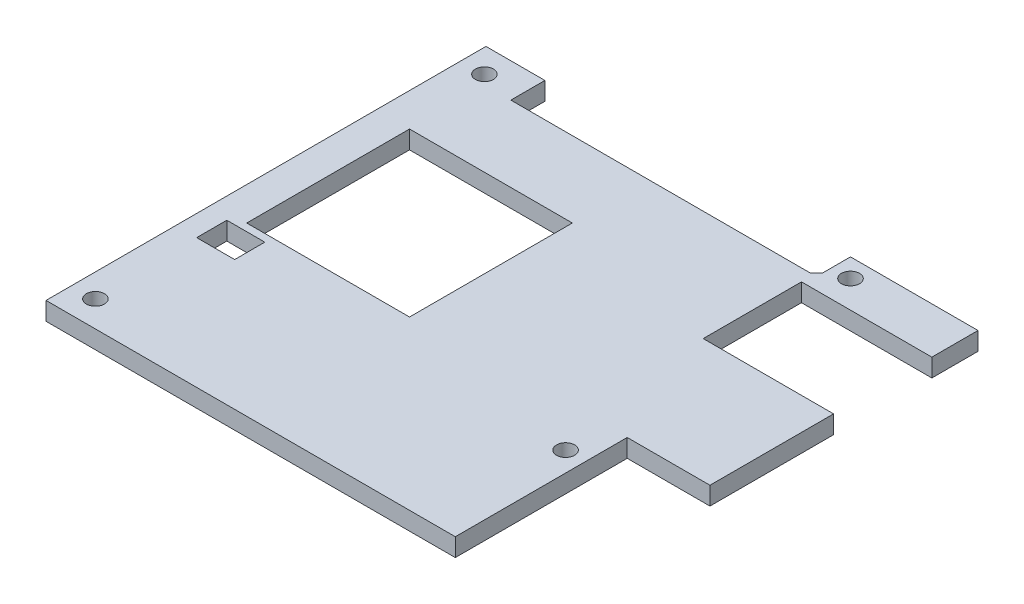
ISO-10303-21;
HEADER;
FILE_DESCRIPTION(('STEP AP214'),'2;1');
FILE_NAME('part.step','',(''),(''),'','','');
FILE_SCHEMA(('AUTOMOTIVE_DESIGN { 1 0 10303 214 1 1 1 1 }'));
ENDSEC;
DATA;
#1=APPLICATION_CONTEXT('core data for automotive mechanical design processes');
#2=APPLICATION_PROTOCOL_DEFINITION('international standard','automotive_design',2000,#1);
#3=PRODUCT_CONTEXT('',#1,'mechanical');
#4=PRODUCT('Part','Part','',(#3));
#5=PRODUCT_RELATED_PRODUCT_CATEGORY('part','',(#4));
#6=PRODUCT_DEFINITION_FORMATION('','',#4);
#7=PRODUCT_DEFINITION_CONTEXT('part definition',#1,'design');
#8=PRODUCT_DEFINITION('design','',#6,#7);
#9=PRODUCT_DEFINITION_SHAPE('','',#8);
#10=(LENGTH_UNIT() NAMED_UNIT(*) SI_UNIT(.MILLI.,.METRE.));
#11=(NAMED_UNIT(*) PLANE_ANGLE_UNIT() SI_UNIT($,.RADIAN.));
#12=(NAMED_UNIT(*) SI_UNIT($,.STERADIAN.) SOLID_ANGLE_UNIT());
#13=UNCERTAINTY_MEASURE_WITH_UNIT(LENGTH_MEASURE(1.E-05),#10,'distance_accuracy_value','');
#14=(GEOMETRIC_REPRESENTATION_CONTEXT(3) GLOBAL_UNCERTAINTY_ASSIGNED_CONTEXT((#13)) GLOBAL_UNIT_ASSIGNED_CONTEXT((#10,
#11,#12)) REPRESENTATION_CONTEXT('',''));
#15=CARTESIAN_POINT('',(0.,0.,0.));
#16=DIRECTION('',(0.,0.,1.));
#17=DIRECTION('',(1.,0.,0.));
#18=AXIS2_PLACEMENT_3D('',#15,#16,#17);
#19=CARTESIAN_POINT('',(0.,3.,-10.));
#20=DIRECTION('',(0.,0.,-1.));
#21=DIRECTION('',(-1.,0.,0.));
#22=AXIS2_PLACEMENT_3D('',#19,#20,#21);
#23=PLANE('',#22);
#24=DIRECTION('',(1.,0.,0.));
#25=VECTOR('',#24,1.);
#26=CARTESIAN_POINT('',(0.,0.,-10.));
#27=LINE('',#26,#25);
#28=CARTESIAN_POINT('',(-3.7,0.,-10.));
#29=VERTEX_POINT('',#28);
#30=CARTESIAN_POINT('',(2.6,0.,-10.));
#31=VERTEX_POINT('',#30);
#32=EDGE_CURVE('E328',#29,#31,#27,.T.);
#33=ORIENTED_EDGE('',*,*,#32,.T.);
#34=DIRECTION('',(0.,-1.,0.));
#35=VECTOR('',#34,1.);
#36=CARTESIAN_POINT('',(2.6,3.,-10.));
#37=LINE('',#36,#35);
#38=CARTESIAN_POINT('',(2.6,3.,-10.));
#39=VERTEX_POINT('',#38);
#40=EDGE_CURVE('E348',#39,#31,#37,.T.);
#41=ORIENTED_EDGE('',*,*,#40,.F.);
#42=DIRECTION('',(1.,0.,0.));
#43=VECTOR('',#42,1.);
#44=CARTESIAN_POINT('',(0.,3.,-10.));
#45=LINE('',#44,#43);
#46=CARTESIAN_POINT('',(-3.7,3.,-10.));
#47=VERTEX_POINT('',#46);
#48=EDGE_CURVE('E259',#47,#39,#45,.T.);
#49=ORIENTED_EDGE('',*,*,#48,.F.);
#50=DIRECTION('',(0.,-1.,0.));
#51=VECTOR('',#50,1.);
#52=CARTESIAN_POINT('',(-3.7,3.,-10.));
#53=LINE('',#52,#51);
#54=EDGE_CURVE('E341',#47,#29,#53,.T.);
#55=ORIENTED_EDGE('',*,*,#54,.T.);
#56=EDGE_LOOP('',(#33,#41,#49,#55));
#57=FACE_BOUND('',#56,.T.);
#58=ADVANCED_FACE('F38',(#57),#23,.F.);
#59=CARTESIAN_POINT('',(2.6,3.,0.));
#60=DIRECTION('',(1.,0.,0.));
#61=DIRECTION('',(0.,0.,-1.));
#62=AXIS2_PLACEMENT_3D('',#59,#60,#61);
#63=PLANE('',#62);
#64=DIRECTION('',(0.,0.,1.));
#65=VECTOR('',#64,1.);
#66=CARTESIAN_POINT('',(2.6,0.,0.));
#67=LINE('',#66,#65);
#68=CARTESIAN_POINT('',(2.6,0.,-5.));
#69=VERTEX_POINT('',#68);
#70=EDGE_CURVE('E331',#31,#69,#67,.T.);
#71=ORIENTED_EDGE('',*,*,#70,.T.);
#72=DIRECTION('',(0.,-1.,0.));
#73=VECTOR('',#72,1.);
#74=CARTESIAN_POINT('',(2.6,3.,-5.));
#75=LINE('',#74,#73);
#76=CARTESIAN_POINT('',(2.6,3.,-5.));
#77=VERTEX_POINT('',#76);
#78=EDGE_CURVE('E346',#77,#69,#75,.T.);
#79=ORIENTED_EDGE('',*,*,#78,.F.);
#80=DIRECTION('',(0.,0.,1.));
#81=VECTOR('',#80,1.);
#82=CARTESIAN_POINT('',(2.6,3.,0.));
#83=LINE('',#82,#81);
#84=EDGE_CURVE('E262',#39,#77,#83,.T.);
#85=ORIENTED_EDGE('',*,*,#84,.F.);
#86=ORIENTED_EDGE('',*,*,#40,.T.);
#87=EDGE_LOOP('',(#71,#79,#85,#86));
#88=FACE_BOUND('',#87,.T.);
#89=ADVANCED_FACE('F411',(#88),#63,.F.);
#90=CARTESIAN_POINT('',(0.,3.,-5.));
#91=DIRECTION('',(0.,0.,-1.));
#92=DIRECTION('',(-1.,0.,0.));
#93=AXIS2_PLACEMENT_3D('',#90,#91,#92);
#94=PLANE('',#93);
#95=DIRECTION('',(1.,0.,0.));
#96=VECTOR('',#95,1.);
#97=CARTESIAN_POINT('',(0.,0.,-5.));
#98=LINE('',#97,#96);
#99=CARTESIAN_POINT('',(-3.7,0.,-5.));
#100=VERTEX_POINT('',#99);
#101=EDGE_CURVE('E334',#100,#69,#98,.T.);
#102=ORIENTED_EDGE('',*,*,#101,.F.);
#103=DIRECTION('',(0.,-1.,0.));
#104=VECTOR('',#103,1.);
#105=CARTESIAN_POINT('',(-3.7,3.,-5.));
#106=LINE('',#105,#104);
#107=CARTESIAN_POINT('',(-3.7,3.,-5.));
#108=VERTEX_POINT('',#107);
#109=EDGE_CURVE('E343',#108,#100,#106,.T.);
#110=ORIENTED_EDGE('',*,*,#109,.F.);
#111=DIRECTION('',(1.,0.,0.));
#112=VECTOR('',#111,1.);
#113=CARTESIAN_POINT('',(0.,3.,-5.));
#114=LINE('',#113,#112);
#115=EDGE_CURVE('E264',#108,#77,#114,.T.);
#116=ORIENTED_EDGE('',*,*,#115,.T.);
#117=ORIENTED_EDGE('',*,*,#78,.T.);
#118=EDGE_LOOP('',(#102,#110,#116,#117));
#119=FACE_BOUND('',#118,.T.);
#120=ADVANCED_FACE('F417',(#119),#94,.T.);
#121=CARTESIAN_POINT('',(25.35,3.,0.));
#122=DIRECTION('',(-1.,0.,0.));
#123=DIRECTION('',(0.,0.,1.));
#124=AXIS2_PLACEMENT_3D('',#121,#122,#123);
#125=PLANE('',#124);
#126=DIRECTION('',(0.,0.,-1.));
#127=VECTOR('',#126,1.);
#128=CARTESIAN_POINT('',(25.35,0.,0.));
#129=LINE('',#128,#127);
#130=CARTESIAN_POINT('',(25.35,0.,-11.25));
#131=VERTEX_POINT('',#130);
#132=CARTESIAN_POINT('',(25.35,0.,-38.25));
#133=VERTEX_POINT('',#132);
#134=EDGE_CURVE('E316',#131,#133,#129,.T.);
#135=ORIENTED_EDGE('',*,*,#134,.F.);
#136=DIRECTION('',(0.,-1.,0.));
#137=VECTOR('',#136,1.);
#138=CARTESIAN_POINT('',(25.35,3.,-11.25));
#139=LINE('',#138,#137);
#140=CARTESIAN_POINT('',(25.35,3.,-11.25));
#141=VERTEX_POINT('',#140);
#142=EDGE_CURVE('E344',#141,#131,#139,.T.);
#143=ORIENTED_EDGE('',*,*,#142,.F.);
#144=DIRECTION('',(0.,0.,-1.));
#145=VECTOR('',#144,1.);
#146=CARTESIAN_POINT('',(25.35,3.,0.));
#147=LINE('',#146,#145);
#148=CARTESIAN_POINT('',(25.35,3.,-38.25));
#149=VERTEX_POINT('',#148);
#150=EDGE_CURVE('E248',#141,#149,#147,.T.);
#151=ORIENTED_EDGE('',*,*,#150,.T.);
#152=DIRECTION('',(0.,-1.,0.));
#153=VECTOR('',#152,1.);
#154=CARTESIAN_POINT('',(25.35,3.,-38.25));
#155=LINE('',#154,#153);
#156=EDGE_CURVE('E202',#149,#133,#155,.T.);
#157=ORIENTED_EDGE('',*,*,#156,.T.);
#158=EDGE_LOOP('',(#135,#143,#151,#157));
#159=FACE_BOUND('',#158,.T.);
#160=ADVANCED_FACE('F435',(#159),#125,.T.);
#161=CARTESIAN_POINT('',(0.,3.,-11.25));
#162=DIRECTION('',(0.,0.,-1.));
#163=DIRECTION('',(-1.,0.,0.));
#164=AXIS2_PLACEMENT_3D('',#161,#162,#163);
#165=PLANE('',#164);
#166=DIRECTION('',(1.,0.,0.));
#167=VECTOR('',#166,1.);
#168=CARTESIAN_POINT('',(0.,0.,-11.25));
#169=LINE('',#168,#167);
#170=CARTESIAN_POINT('',(-1.65,0.,-11.25));
#171=VERTEX_POINT('',#170);
#172=EDGE_CURVE('E319',#171,#131,#169,.T.);
#173=ORIENTED_EDGE('',*,*,#172,.F.);
#174=DIRECTION('',(0.,-1.,0.));
#175=VECTOR('',#174,1.);
#176=CARTESIAN_POINT('',(-1.65,3.,-11.25));
#177=LINE('',#176,#175);
#178=CARTESIAN_POINT('',(-1.65,3.,-11.25));
#179=VERTEX_POINT('',#178);
#180=EDGE_CURVE('E356',#179,#171,#177,.T.);
#181=ORIENTED_EDGE('',*,*,#180,.F.);
#182=DIRECTION('',(1.,0.,0.));
#183=VECTOR('',#182,1.);
#184=CARTESIAN_POINT('',(0.,3.,-11.25));
#185=LINE('',#184,#183);
#186=EDGE_CURVE('E251',#179,#141,#185,.T.);
#187=ORIENTED_EDGE('',*,*,#186,.T.);
#188=ORIENTED_EDGE('',*,*,#142,.T.);
#189=EDGE_LOOP('',(#173,#181,#187,#188));
#190=FACE_BOUND('',#189,.T.);
#191=ADVANCED_FACE('F431',(#190),#165,.T.);
#192=CARTESIAN_POINT('',(-1.65,3.,0.));
#193=DIRECTION('',(-1.,0.,0.));
#194=DIRECTION('',(0.,0.,1.));
#195=AXIS2_PLACEMENT_3D('',#192,#193,#194);
#196=PLANE('',#195);
#197=DIRECTION('',(0.,0.,-1.));
#198=VECTOR('',#197,1.);
#199=CARTESIAN_POINT('',(-1.65,0.,0.));
#200=LINE('',#199,#198);
#201=CARTESIAN_POINT('',(-1.65,0.,-38.25));
#202=VERTEX_POINT('',#201);
#203=EDGE_CURVE('E322',#171,#202,#200,.T.);
#204=ORIENTED_EDGE('',*,*,#203,.T.);
#205=DIRECTION('',(0.,-1.,0.));
#206=VECTOR('',#205,1.);
#207=CARTESIAN_POINT('',(-1.65,3.,-38.25));
#208=LINE('',#207,#206);
#209=CARTESIAN_POINT('',(-1.65,3.,-38.25));
#210=VERTEX_POINT('',#209);
#211=EDGE_CURVE('E353',#210,#202,#208,.T.);
#212=ORIENTED_EDGE('',*,*,#211,.F.);
#213=DIRECTION('',(0.,0.,-1.));
#214=VECTOR('',#213,1.);
#215=CARTESIAN_POINT('',(-1.65,3.,0.));
#216=LINE('',#215,#214);
#217=EDGE_CURVE('E254',#179,#210,#216,.T.);
#218=ORIENTED_EDGE('',*,*,#217,.F.);
#219=ORIENTED_EDGE('',*,*,#180,.T.);
#220=EDGE_LOOP('',(#204,#212,#218,#219));
#221=FACE_BOUND('',#220,.T.);
#222=ADVANCED_FACE('F428',(#221),#196,.F.);
#223=CARTESIAN_POINT('',(60.7,3.,0.));
#224=DIRECTION('',(1.,0.,0.));
#225=DIRECTION('',(0.,0.,-1.));
#226=AXIS2_PLACEMENT_3D('',#223,#224,#225);
#227=PLANE('',#226);
#228=DIRECTION('',(0.,0.,1.));
#229=VECTOR('',#228,1.);
#230=CARTESIAN_POINT('',(60.7,0.,0.));
#231=LINE('',#230,#229);
#232=CARTESIAN_POINT('',(60.7,0.,-12.));
#233=VERTEX_POINT('',#232);
#234=CARTESIAN_POINT('',(60.7,0.,16.51));
#235=VERTEX_POINT('',#234);
#236=EDGE_CURVE('E197',#233,#235,#231,.T.);
#237=ORIENTED_EDGE('',*,*,#236,.F.);
#238=DIRECTION('',(0.,-1.,0.));
#239=VECTOR('',#238,1.);
#240=CARTESIAN_POINT('',(60.7,3.,-12.));
#241=LINE('',#240,#239);
#242=CARTESIAN_POINT('',(60.7,3.,-12.));
#243=VERTEX_POINT('',#242);
#244=EDGE_CURVE('E192',#243,#233,#241,.T.);
#245=ORIENTED_EDGE('',*,*,#244,.F.);
#246=DIRECTION('',(0.,0.,1.));
#247=VECTOR('',#246,1.);
#248=CARTESIAN_POINT('',(60.7,3.,0.));
#249=LINE('',#248,#247);
#250=CARTESIAN_POINT('',(60.7,3.,16.51));
#251=VERTEX_POINT('',#250);
#252=EDGE_CURVE('E195',#243,#251,#249,.T.);
#253=ORIENTED_EDGE('',*,*,#252,.T.);
#254=DIRECTION('',(0.,-1.,0.));
#255=VECTOR('',#254,1.);
#256=CARTESIAN_POINT('',(60.7,3.,16.51));
#257=LINE('',#256,#255);
#258=EDGE_CURVE('E270',#251,#235,#257,.T.);
#259=ORIENTED_EDGE('',*,*,#258,.T.);
#260=EDGE_LOOP('',(#237,#245,#253,#259));
#261=FACE_BOUND('',#260,.T.);
#262=ADVANCED_FACE('F194',(#261),#227,.T.);
#263=CARTESIAN_POINT('',(0.,3.,-12.));
#264=DIRECTION('',(0.,0.,1.));
#265=DIRECTION('',(1.,0.,0.));
#266=AXIS2_PLACEMENT_3D('',#263,#264,#265);
#267=PLANE('',#266);
#268=DIRECTION('',(-1.,0.,0.));
#269=VECTOR('',#268,1.);
#270=CARTESIAN_POINT('',(0.,0.,-12.));
#271=LINE('',#270,#269);
#272=CARTESIAN_POINT('',(74.421,0.,-12.));
#273=VERTEX_POINT('',#272);
#274=EDGE_CURVE('E284',#273,#233,#271,.T.);
#275=ORIENTED_EDGE('',*,*,#274,.F.);
#276=DIRECTION('',(0.,-1.,0.));
#277=VECTOR('',#276,1.);
#278=CARTESIAN_POINT('',(74.421,3.,-12.));
#279=LINE('',#278,#277);
#280=CARTESIAN_POINT('',(74.421,3.,-12.));
#281=VERTEX_POINT('',#280);
#282=EDGE_CURVE('E203',#281,#273,#279,.T.);
#283=ORIENTED_EDGE('',*,*,#282,.F.);
#284=DIRECTION('',(-1.,0.,0.));
#285=VECTOR('',#284,1.);
#286=CARTESIAN_POINT('',(0.,3.,-12.));
#287=LINE('',#286,#285);
#288=EDGE_CURVE('E210',#281,#243,#287,.T.);
#289=ORIENTED_EDGE('',*,*,#288,.T.);
#290=ORIENTED_EDGE('',*,*,#244,.T.);
#291=EDGE_LOOP('',(#275,#283,#289,#290));
#292=FACE_BOUND('',#291,.T.);
#293=ADVANCED_FACE('F217',(#292),#267,.T.);
#294=CARTESIAN_POINT('',(74.421,3.,0.));
#295=DIRECTION('',(-1.,0.,0.));
#296=DIRECTION('',(0.,0.,1.));
#297=AXIS2_PLACEMENT_3D('',#294,#295,#296);
#298=PLANE('',#297);
#299=DIRECTION('',(0.,0.,-1.));
#300=VECTOR('',#299,1.);
#301=CARTESIAN_POINT('',(74.421,0.,0.));
#302=LINE('',#301,#300);
#303=CARTESIAN_POINT('',(74.421,0.,-32.5));
#304=VERTEX_POINT('',#303);
#305=EDGE_CURVE('E286',#273,#304,#302,.T.);
#306=ORIENTED_EDGE('',*,*,#305,.T.);
#307=DIRECTION('',(0.,-1.,0.));
#308=VECTOR('',#307,1.);
#309=CARTESIAN_POINT('',(74.421,3.,-32.5));
#310=LINE('',#309,#308);
#311=CARTESIAN_POINT('',(74.421,3.,-32.5));
#312=VERTEX_POINT('',#311);
#313=EDGE_CURVE('E379',#312,#304,#310,.T.);
#314=ORIENTED_EDGE('',*,*,#313,.F.);
#315=DIRECTION('',(0.,0.,-1.));
#316=VECTOR('',#315,1.);
#317=CARTESIAN_POINT('',(74.421,3.,0.));
#318=LINE('',#317,#316);
#319=EDGE_CURVE('E219',#281,#312,#318,.T.);
#320=ORIENTED_EDGE('',*,*,#319,.F.);
#321=ORIENTED_EDGE('',*,*,#282,.T.);
#322=EDGE_LOOP('',(#306,#314,#320,#321));
#323=FACE_BOUND('',#322,.T.);
#324=ADVANCED_FACE('F464',(#323),#298,.F.);
#325=CARTESIAN_POINT('',(0.,3.,-32.5));
#326=DIRECTION('',(0.,0.,1.));
#327=DIRECTION('',(1.,0.,0.));
#328=AXIS2_PLACEMENT_3D('',#325,#326,#327);
#329=PLANE('',#328);
#330=DIRECTION('',(-1.,0.,0.));
#331=VECTOR('',#330,1.);
#332=CARTESIAN_POINT('',(0.,0.,-32.5));
#333=LINE('',#332,#331);
#334=CARTESIAN_POINT('',(52.8,0.,-32.5));
#335=VERTEX_POINT('',#334);
#336=EDGE_CURVE('E289',#304,#335,#333,.T.);
#337=ORIENTED_EDGE('',*,*,#336,.T.);
#338=DIRECTION('',(0.,-1.,0.));
#339=VECTOR('',#338,1.);
#340=CARTESIAN_POINT('',(52.8,3.,-32.5));
#341=LINE('',#340,#339);
#342=CARTESIAN_POINT('',(52.8,3.,-32.5));
#343=VERTEX_POINT('',#342);
#344=EDGE_CURVE('E377',#343,#335,#341,.T.);
#345=ORIENTED_EDGE('',*,*,#344,.F.);
#346=DIRECTION('',(-1.,0.,0.));
#347=VECTOR('',#346,1.);
#348=CARTESIAN_POINT('',(0.,3.,-32.5));
#349=LINE('',#348,#347);
#350=EDGE_CURVE('E221',#312,#343,#349,.T.);
#351=ORIENTED_EDGE('',*,*,#350,.F.);
#352=ORIENTED_EDGE('',*,*,#313,.T.);
#353=EDGE_LOOP('',(#337,#345,#351,#352));
#354=FACE_BOUND('',#353,.T.);
#355=ADVANCED_FACE('F471',(#354),#329,.F.);
#356=CARTESIAN_POINT('',(52.8,3.,0.));
#357=DIRECTION('',(1.,0.,0.));
#358=DIRECTION('',(0.,0.,-1.));
#359=AXIS2_PLACEMENT_3D('',#356,#357,#358);
#360=PLANE('',#359);
#361=DIRECTION('',(0.,0.,1.));
#362=VECTOR('',#361,1.);
#363=CARTESIAN_POINT('',(52.8,0.,0.));
#364=LINE('',#363,#362);
#365=CARTESIAN_POINT('',(52.8,0.,-48.8));
#366=VERTEX_POINT('',#365);
#367=EDGE_CURVE('E293',#366,#335,#364,.T.);
#368=ORIENTED_EDGE('',*,*,#367,.F.);
#369=DIRECTION('',(0.,-1.,0.));
#370=VECTOR('',#369,1.);
#371=CARTESIAN_POINT('',(52.8,3.,-48.8));
#372=LINE('',#371,#370);
#373=CARTESIAN_POINT('',(52.8,3.,-48.8));
#374=VERTEX_POINT('',#373);
#375=EDGE_CURVE('E375',#374,#366,#372,.T.);
#376=ORIENTED_EDGE('',*,*,#375,.F.);
#377=DIRECTION('',(0.,0.,1.));
#378=VECTOR('',#377,1.);
#379=CARTESIAN_POINT('',(52.8,3.,0.));
#380=LINE('',#379,#378);
#381=EDGE_CURVE('E227',#374,#343,#380,.T.);
#382=ORIENTED_EDGE('',*,*,#381,.T.);
#383=ORIENTED_EDGE('',*,*,#344,.T.);
#384=EDGE_LOOP('',(#368,#376,#382,#383));
#385=FACE_BOUND('',#384,.T.);
#386=ADVANCED_FACE('F467',(#385),#360,.T.);
#387=CARTESIAN_POINT('',(0.,3.,-48.8));
#388=DIRECTION('',(0.,0.,1.));
#389=DIRECTION('',(1.,0.,0.));
#390=AXIS2_PLACEMENT_3D('',#387,#388,#389);
#391=PLANE('',#390);
#392=DIRECTION('',(-1.,0.,0.));
#393=VECTOR('',#392,1.);
#394=CARTESIAN_POINT('',(0.,0.,-48.8));
#395=LINE('',#394,#393);
#396=CARTESIAN_POINT('',(74.421,0.,-48.8));
#397=VERTEX_POINT('',#396);
#398=EDGE_CURVE('E296',#397,#366,#395,.T.);
#399=ORIENTED_EDGE('',*,*,#398,.F.);
#400=DIRECTION('',(0.,-1.,0.));
#401=VECTOR('',#400,1.);
#402=CARTESIAN_POINT('',(74.421,3.,-48.8));
#403=LINE('',#402,#401);
#404=CARTESIAN_POINT('',(74.421,3.,-48.8));
#405=VERTEX_POINT('',#404);
#406=EDGE_CURVE('E373',#405,#397,#403,.T.);
#407=ORIENTED_EDGE('',*,*,#406,.F.);
#408=DIRECTION('',(-1.,0.,0.));
#409=VECTOR('',#408,1.);
#410=CARTESIAN_POINT('',(0.,3.,-48.8));
#411=LINE('',#410,#409);
#412=EDGE_CURVE('E230',#405,#374,#411,.T.);
#413=ORIENTED_EDGE('',*,*,#412,.T.);
#414=ORIENTED_EDGE('',*,*,#375,.T.);
#415=EDGE_LOOP('',(#399,#407,#413,#414));
#416=FACE_BOUND('',#415,.T.);
#417=ADVANCED_FACE('F462',(#416),#391,.T.);
#418=CARTESIAN_POINT('',(74.421,0.,-56.452));
#419=VERTEX_POINT('',#418);
#420=EDGE_CURVE('E290',#397,#419,#302,.T.);
#421=ORIENTED_EDGE('',*,*,#420,.T.);
#422=DIRECTION('',(0.,-1.,0.));
#423=VECTOR('',#422,1.);
#424=CARTESIAN_POINT('',(74.421,3.,-56.452));
#425=LINE('',#424,#423);
#426=CARTESIAN_POINT('',(74.421,3.,-56.452));
#427=VERTEX_POINT('',#426);
#428=EDGE_CURVE('E371',#427,#419,#425,.T.);
#429=ORIENTED_EDGE('',*,*,#428,.F.);
#430=EDGE_CURVE('E223',#405,#427,#318,.T.);
#431=ORIENTED_EDGE('',*,*,#430,.F.);
#432=ORIENTED_EDGE('',*,*,#406,.T.);
#433=EDGE_LOOP('',(#421,#429,#431,#432));
#434=FACE_BOUND('',#433,.T.);
#435=ADVANCED_FACE('F459',(#434),#298,.F.);
#436=CARTESIAN_POINT('',(0.,3.,-56.452));
#437=DIRECTION('',(0.,0.,-1.));
#438=DIRECTION('',(-1.,0.,0.));
#439=AXIS2_PLACEMENT_3D('',#436,#437,#438);
#440=PLANE('',#439);
#441=DIRECTION('',(1.,0.,0.));
#442=VECTOR('',#441,1.);
#443=CARTESIAN_POINT('',(0.,0.,-56.452));
#444=LINE('',#443,#442);
#445=CARTESIAN_POINT('',(53.276,0.,-56.452));
#446=VERTEX_POINT('',#445);
#447=EDGE_CURVE('E299',#446,#419,#444,.T.);
#448=ORIENTED_EDGE('',*,*,#447,.F.);
#449=DIRECTION('',(0.,-1.,0.));
#450=VECTOR('',#449,1.);
#451=CARTESIAN_POINT('',(53.276,3.,-56.452));
#452=LINE('',#451,#450);
#453=CARTESIAN_POINT('',(53.276,3.,-56.452));
#454=VERTEX_POINT('',#453);
#455=EDGE_CURVE('E368',#454,#446,#452,.T.);
#456=ORIENTED_EDGE('',*,*,#455,.F.);
#457=DIRECTION('',(1.,0.,0.));
#458=VECTOR('',#457,1.);
#459=CARTESIAN_POINT('',(0.,3.,-56.452));
#460=LINE('',#459,#458);
#461=EDGE_CURVE('E233',#454,#427,#460,.T.);
#462=ORIENTED_EDGE('',*,*,#461,.T.);
#463=ORIENTED_EDGE('',*,*,#428,.T.);
#464=EDGE_LOOP('',(#448,#456,#462,#463));
#465=FACE_BOUND('',#464,.T.);
#466=ADVANCED_FACE('F451',(#465),#440,.T.);
#467=CARTESIAN_POINT('',(53.276,3.,0.));
#468=DIRECTION('',(-1.,0.,0.));
#469=DIRECTION('',(0.,0.,1.));
#470=AXIS2_PLACEMENT_3D('',#467,#468,#469);
#471=PLANE('',#470);
#472=DIRECTION('',(0.,0.,-1.));
#473=VECTOR('',#472,1.);
#474=CARTESIAN_POINT('',(53.276,0.,0.));
#475=LINE('',#474,#473);
#476=CARTESIAN_POINT('',(53.276,0.,-51.8));
#477=VERTEX_POINT('',#476);
#478=EDGE_CURVE('E302',#477,#446,#475,.T.);
#479=ORIENTED_EDGE('',*,*,#478,.F.);
#480=DIRECTION('',(0.,1.,0.));
#481=VECTOR('',#480,1.);
#482=CARTESIAN_POINT('',(53.276,3.,-51.8));
#483=LINE('',#482,#481);
#484=CARTESIAN_POINT('',(53.276,3.,-51.8));
#485=VERTEX_POINT('',#484);
#486=EDGE_CURVE('E54',#477,#485,#483,.T.);
#487=ORIENTED_EDGE('',*,*,#486,.T.);
#488=DIRECTION('',(0.,0.,-1.));
#489=VECTOR('',#488,1.);
#490=CARTESIAN_POINT('',(53.276,3.,0.));
#491=LINE('',#490,#489);
#492=EDGE_CURVE('E236',#485,#454,#491,.T.);
#493=ORIENTED_EDGE('',*,*,#492,.T.);
#494=ORIENTED_EDGE('',*,*,#455,.T.);
#495=EDGE_LOOP('',(#479,#487,#493,#494));
#496=FACE_BOUND('',#495,.T.);
#497=ADVANCED_FACE('F456',(#496),#471,.T.);
#498=CARTESIAN_POINT('',(0.,3.,-50.8));
#499=DIRECTION('',(0.,0.,-1.));
#500=DIRECTION('',(-1.,0.,0.));
#501=AXIS2_PLACEMENT_3D('',#498,#499,#500);
#502=PLANE('',#501);
#503=DIRECTION('',(1.,0.,0.));
#504=VECTOR('',#503,1.);
#505=CARTESIAN_POINT('',(0.,3.,-50.8));
#506=LINE('',#505,#504);
#507=CARTESIAN_POINT('',(2.6,3.,-50.8));
#508=VERTEX_POINT('',#507);
#509=CARTESIAN_POINT('',(52.276,3.,-50.8));
#510=VERTEX_POINT('',#509);
#511=EDGE_CURVE('E239',#508,#510,#506,.T.);
#512=ORIENTED_EDGE('',*,*,#511,.T.);
#513=DIRECTION('',(0.,-1.,0.));
#514=VECTOR('',#513,1.);
#515=CARTESIAN_POINT('',(52.276,0.,-50.8));
#516=LINE('',#515,#514);
#517=CARTESIAN_POINT('',(52.276,0.,-50.8));
#518=VERTEX_POINT('',#517);
#519=EDGE_CURVE('E351',#510,#518,#516,.T.);
#520=ORIENTED_EDGE('',*,*,#519,.T.);
#521=DIRECTION('',(1.,0.,0.));
#522=VECTOR('',#521,1.);
#523=CARTESIAN_POINT('',(0.,0.,-50.8));
#524=LINE('',#523,#522);
#525=CARTESIAN_POINT('',(2.6,0.,-50.8));
#526=VERTEX_POINT('',#525);
#527=EDGE_CURVE('E305',#526,#518,#524,.T.);
#528=ORIENTED_EDGE('',*,*,#527,.F.);
#529=DIRECTION('',(0.,-1.,0.));
#530=VECTOR('',#529,1.);
#531=CARTESIAN_POINT('',(2.6,3.,-50.8));
#532=LINE('',#531,#530);
#533=EDGE_CURVE('E366',#508,#526,#532,.T.);
#534=ORIENTED_EDGE('',*,*,#533,.F.);
#535=EDGE_LOOP('',(#512,#520,#528,#534));
#536=FACE_BOUND('',#535,.T.);
#537=ADVANCED_FACE('F388',(#536),#502,.T.);
#538=CARTESIAN_POINT('',(2.6,3.,0.));
#539=DIRECTION('',(-1.,0.,0.));
#540=DIRECTION('',(0.,0.,1.));
#541=AXIS2_PLACEMENT_3D('',#538,#539,#540);
#542=PLANE('',#541);
#543=DIRECTION('',(0.,0.,-1.));
#544=VECTOR('',#543,1.);
#545=CARTESIAN_POINT('',(2.6,0.,0.));
#546=LINE('',#545,#544);
#547=CARTESIAN_POINT('',(2.6,0.,-56.452));
#548=VERTEX_POINT('',#547);
#549=EDGE_CURVE('E307',#526,#548,#546,.T.);
#550=ORIENTED_EDGE('',*,*,#549,.T.);
#551=DIRECTION('',(0.,-1.,0.));
#552=VECTOR('',#551,1.);
#553=CARTESIAN_POINT('',(2.6,3.,-56.452));
#554=LINE('',#553,#552);
#555=CARTESIAN_POINT('',(2.6,3.,-56.452));
#556=VERTEX_POINT('',#555);
#557=EDGE_CURVE('E364',#556,#548,#554,.T.);
#558=ORIENTED_EDGE('',*,*,#557,.F.);
#559=DIRECTION('',(0.,0.,-1.));
#560=VECTOR('',#559,1.);
#561=CARTESIAN_POINT('',(2.6,3.,0.));
#562=LINE('',#561,#560);
#563=EDGE_CURVE('E242',#508,#556,#562,.T.);
#564=ORIENTED_EDGE('',*,*,#563,.F.);
#565=ORIENTED_EDGE('',*,*,#533,.T.);
#566=EDGE_LOOP('',(#550,#558,#564,#565));
#567=FACE_BOUND('',#566,.T.);
#568=ADVANCED_FACE('F399',(#567),#542,.F.);
#569=CARTESIAN_POINT('',(-7.176,0.,-56.452));
#570=VERTEX_POINT('',#569);
#571=EDGE_CURVE('E303',#570,#548,#444,.T.);
#572=ORIENTED_EDGE('',*,*,#571,.F.);
#573=DIRECTION('',(0.,-1.,0.));
#574=VECTOR('',#573,1.);
#575=CARTESIAN_POINT('',(-7.176,3.,-56.452));
#576=LINE('',#575,#574);
#577=CARTESIAN_POINT('',(-7.176,3.,-56.452));
#578=VERTEX_POINT('',#577);
#579=EDGE_CURVE('E362',#578,#570,#576,.T.);
#580=ORIENTED_EDGE('',*,*,#579,.F.);
#581=EDGE_CURVE('E237',#578,#556,#460,.T.);
#582=ORIENTED_EDGE('',*,*,#581,.T.);
#583=ORIENTED_EDGE('',*,*,#557,.T.);
#584=EDGE_LOOP('',(#572,#580,#582,#583));
#585=FACE_BOUND('',#584,.T.);
#586=ADVANCED_FACE('F446',(#585),#440,.T.);
#587=CARTESIAN_POINT('',(-7.176,3.,0.));
#588=DIRECTION('',(-1.,0.,0.));
#589=DIRECTION('',(0.,0.,1.));
#590=AXIS2_PLACEMENT_3D('',#587,#588,#589);
#591=PLANE('',#590);
#592=DIRECTION('',(0.,0.,-1.));
#593=VECTOR('',#592,1.);
#594=CARTESIAN_POINT('',(-7.176,0.,0.));
#595=LINE('',#594,#593);
#596=CARTESIAN_POINT('',(-7.176,0.,16.51));
#597=VERTEX_POINT('',#596);
#598=EDGE_CURVE('E310',#597,#570,#595,.T.);
#599=ORIENTED_EDGE('',*,*,#598,.F.);
#600=DIRECTION('',(0.,-1.,0.));
#601=VECTOR('',#600,1.);
#602=CARTESIAN_POINT('',(-7.176,3.,16.51));
#603=LINE('',#602,#601);
#604=CARTESIAN_POINT('',(-7.176,3.,16.51));
#605=VERTEX_POINT('',#604);
#606=EDGE_CURVE('E360',#605,#597,#603,.T.);
#607=ORIENTED_EDGE('',*,*,#606,.F.);
#608=DIRECTION('',(0.,0.,-1.));
#609=VECTOR('',#608,1.);
#610=CARTESIAN_POINT('',(-7.176,3.,0.));
#611=LINE('',#610,#609);
#612=EDGE_CURVE('E244',#605,#578,#611,.T.);
#613=ORIENTED_EDGE('',*,*,#612,.T.);
#614=ORIENTED_EDGE('',*,*,#579,.T.);
#615=EDGE_LOOP('',(#599,#607,#613,#614));
#616=FACE_BOUND('',#615,.T.);
#617=ADVANCED_FACE('F426',(#616),#591,.T.);
#618=CARTESIAN_POINT('',(0.,3.,-38.25));
#619=DIRECTION('',(0.,0.,-1.));
#620=DIRECTION('',(-1.,0.,0.));
#621=AXIS2_PLACEMENT_3D('',#618,#619,#620);
#622=PLANE('',#621);
#623=DIRECTION('',(1.,0.,0.));
#624=VECTOR('',#623,1.);
#625=CARTESIAN_POINT('',(0.,0.,-38.25));
#626=LINE('',#625,#624);
#627=EDGE_CURVE('E325',#202,#133,#626,.T.);
#628=ORIENTED_EDGE('',*,*,#627,.T.);
#629=ORIENTED_EDGE('',*,*,#156,.F.);
#630=DIRECTION('',(1.,0.,0.));
#631=VECTOR('',#630,1.);
#632=CARTESIAN_POINT('',(0.,3.,-38.25));
#633=LINE('',#632,#631);
#634=EDGE_CURVE('E257',#210,#149,#633,.T.);
#635=ORIENTED_EDGE('',*,*,#634,.F.);
#636=ORIENTED_EDGE('',*,*,#211,.T.);
#637=EDGE_LOOP('',(#628,#629,#635,#636));
#638=FACE_BOUND('',#637,.T.);
#639=ADVANCED_FACE('F422',(#638),#622,.F.);
#640=CARTESIAN_POINT('',(0.,3.,16.51));
#641=DIRECTION('',(0.,0.,-1.));
#642=DIRECTION('',(-1.,0.,0.));
#643=AXIS2_PLACEMENT_3D('',#640,#641,#642);
#644=PLANE('',#643);
#645=DIRECTION('',(1.,0.,0.));
#646=VECTOR('',#645,1.);
#647=CARTESIAN_POINT('',(0.,0.,16.51));
#648=LINE('',#647,#646);
#649=EDGE_CURVE('E313',#597,#235,#648,.T.);
#650=ORIENTED_EDGE('',*,*,#649,.T.);
#651=ORIENTED_EDGE('',*,*,#258,.F.);
#652=DIRECTION('',(1.,0.,0.));
#653=VECTOR('',#652,1.);
#654=CARTESIAN_POINT('',(0.,3.,16.51));
#655=LINE('',#654,#653);
#656=EDGE_CURVE('E213',#605,#251,#655,.T.);
#657=ORIENTED_EDGE('',*,*,#656,.F.);
#658=ORIENTED_EDGE('',*,*,#606,.T.);
#659=EDGE_LOOP('',(#650,#651,#657,#658));
#660=FACE_BOUND('',#659,.T.);
#661=ADVANCED_FACE('F425',(#660),#644,.F.);
#662=CARTESIAN_POINT('',(-3.302,3.,12.192));
#663=DIRECTION('',(0.,-1.,0.));
#664=DIRECTION('',(0.,0.,-1.));
#665=AXIS2_PLACEMENT_3D('',#662,#663,#664);
#666=CYLINDRICAL_SURFACE('',#665,1.5);
#667=CARTESIAN_POINT('',(-3.302,3.,12.192));
#668=DIRECTION('',(0.,1.,0.));
#669=DIRECTION('',(0.,0.,1.));
#670=AXIS2_PLACEMENT_3D('',#667,#668,#669);
#671=CIRCLE('',#670,1.5);
#672=CARTESIAN_POINT('',(-3.302,3.,13.692));
#673=VERTEX_POINT('',#672);
#674=EDGE_CURVE('E215',#673,#673,#671,.T.);
#675=ORIENTED_EDGE('',*,*,#674,.T.);
#676=EDGE_LOOP('',(#675));
#677=FACE_BOUND('',#676,.T.);
#678=CARTESIAN_POINT('',(-3.302,0.,12.192));
#679=DIRECTION('',(0.,1.,0.));
#680=DIRECTION('',(0.,0.,1.));
#681=AXIS2_PLACEMENT_3D('',#678,#679,#680);
#682=CIRCLE('',#681,1.5);
#683=CARTESIAN_POINT('',(-3.302,0.,13.692));
#684=VERTEX_POINT('',#683);
#685=EDGE_CURVE('E280',#684,#684,#682,.T.);
#686=ORIENTED_EDGE('',*,*,#685,.F.);
#687=EDGE_LOOP('',(#686));
#688=FACE_BOUND('',#687,.T.);
#689=ADVANCED_FACE('F442',(#677,#688),#666,.F.);
#690=CARTESIAN_POINT('',(-3.30200000000001,3.,-52.324));
#691=DIRECTION('',(0.,-1.,0.));
#692=DIRECTION('',(0.,0.,-1.));
#693=AXIS2_PLACEMENT_3D('',#690,#691,#692);
#694=CYLINDRICAL_SURFACE('',#693,1.5);
#695=CARTESIAN_POINT('',(-3.30200000000001,3.,-52.324));
#696=DIRECTION('',(0.,1.,0.));
#697=DIRECTION('',(0.,0.,1.));
#698=AXIS2_PLACEMENT_3D('',#695,#696,#697);
#699=CIRCLE('',#698,1.5);
#700=CARTESIAN_POINT('',(-3.30200000000001,3.,-50.824));
#701=VERTEX_POINT('',#700);
#702=EDGE_CURVE('E516',#701,#701,#699,.T.);
#703=ORIENTED_EDGE('',*,*,#702,.T.);
#704=EDGE_LOOP('',(#703));
#705=FACE_BOUND('',#704,.T.);
#706=CARTESIAN_POINT('',(-3.30200000000001,0.,-52.324));
#707=DIRECTION('',(0.,1.,0.));
#708=DIRECTION('',(0.,0.,1.));
#709=AXIS2_PLACEMENT_3D('',#706,#707,#708);
#710=CIRCLE('',#709,1.5);
#711=CARTESIAN_POINT('',(-3.30200000000001,0.,-50.824));
#712=VERTEX_POINT('',#711);
#713=EDGE_CURVE('E277',#712,#712,#710,.T.);
#714=ORIENTED_EDGE('',*,*,#713,.F.);
#715=EDGE_LOOP('',(#714));
#716=FACE_BOUND('',#715,.T.);
#717=ADVANCED_FACE('F482',(#705,#716),#694,.F.);
#718=CARTESIAN_POINT('',(56.388,3.,-53.34));
#719=DIRECTION('',(0.,-1.,0.));
#720=DIRECTION('',(0.,0.,-1.));
#721=AXIS2_PLACEMENT_3D('',#718,#719,#720);
#722=CYLINDRICAL_SURFACE('',#721,1.5);
#723=CARTESIAN_POINT('',(56.388,3.,-53.34));
#724=DIRECTION('',(0.,1.,0.));
#725=DIRECTION('',(0.,0.,1.));
#726=AXIS2_PLACEMENT_3D('',#723,#724,#725);
#727=CIRCLE('',#726,1.5);
#728=CARTESIAN_POINT('',(56.388,3.,-51.84));
#729=VERTEX_POINT('',#728);
#730=EDGE_CURVE('E513',#729,#729,#727,.T.);
#731=ORIENTED_EDGE('',*,*,#730,.T.);
#732=EDGE_LOOP('',(#731));
#733=FACE_BOUND('',#732,.T.);
#734=CARTESIAN_POINT('',(56.388,0.,-53.34));
#735=DIRECTION('',(0.,1.,0.));
#736=DIRECTION('',(0.,0.,1.));
#737=AXIS2_PLACEMENT_3D('',#734,#735,#736);
#738=CIRCLE('',#737,1.5);
#739=CARTESIAN_POINT('',(56.388,0.,-51.84));
#740=VERTEX_POINT('',#739);
#741=EDGE_CURVE('E274',#740,#740,#738,.T.);
#742=ORIENTED_EDGE('',*,*,#741,.F.);
#743=EDGE_LOOP('',(#742));
#744=FACE_BOUND('',#743,.T.);
#745=ADVANCED_FACE('F486',(#733,#744),#722,.F.);
#746=CARTESIAN_POINT('',(57.404,3.,-5.08));
#747=DIRECTION('',(0.,-1.,0.));
#748=DIRECTION('',(0.,0.,-1.));
#749=AXIS2_PLACEMENT_3D('',#746,#747,#748);
#750=CYLINDRICAL_SURFACE('',#749,1.5);
#751=CARTESIAN_POINT('',(57.404,3.,-5.08));
#752=DIRECTION('',(0.,1.,0.));
#753=DIRECTION('',(0.,0.,1.));
#754=AXIS2_PLACEMENT_3D('',#751,#752,#753);
#755=CIRCLE('',#754,1.5);
#756=CARTESIAN_POINT('',(57.404,3.,-3.58));
#757=VERTEX_POINT('',#756);
#758=EDGE_CURVE('E340',#757,#757,#755,.T.);
#759=ORIENTED_EDGE('',*,*,#758,.T.);
#760=EDGE_LOOP('',(#759));
#761=FACE_BOUND('',#760,.T.);
#762=CARTESIAN_POINT('',(57.404,0.,-5.08));
#763=DIRECTION('',(0.,1.,0.));
#764=DIRECTION('',(0.,0.,1.));
#765=AXIS2_PLACEMENT_3D('',#762,#763,#764);
#766=CIRCLE('',#765,1.5);
#767=CARTESIAN_POINT('',(57.404,0.,-3.58));
#768=VERTEX_POINT('',#767);
#769=EDGE_CURVE('E271',#768,#768,#766,.T.);
#770=ORIENTED_EDGE('',*,*,#769,.F.);
#771=EDGE_LOOP('',(#770));
#772=FACE_BOUND('',#771,.T.);
#773=ADVANCED_FACE('F489',(#761,#772),#750,.F.);
#774=CARTESIAN_POINT('',(-3.7,3.,0.));
#775=DIRECTION('',(1.,0.,0.));
#776=DIRECTION('',(0.,0.,-1.));
#777=AXIS2_PLACEMENT_3D('',#774,#775,#776);
#778=PLANE('',#777);
#779=DIRECTION('',(0.,0.,1.));
#780=VECTOR('',#779,1.);
#781=CARTESIAN_POINT('',(-3.7,0.,0.));
#782=LINE('',#781,#780);
#783=EDGE_CURVE('E337',#29,#100,#782,.T.);
#784=ORIENTED_EDGE('',*,*,#783,.F.);
#785=ORIENTED_EDGE('',*,*,#54,.F.);
#786=DIRECTION('',(0.,0.,1.));
#787=VECTOR('',#786,1.);
#788=CARTESIAN_POINT('',(-3.7,3.,0.));
#789=LINE('',#788,#787);
#790=EDGE_CURVE('E267',#47,#108,#789,.T.);
#791=ORIENTED_EDGE('',*,*,#790,.T.);
#792=ORIENTED_EDGE('',*,*,#109,.T.);
#793=EDGE_LOOP('',(#784,#785,#791,#792));
#794=FACE_BOUND('',#793,.T.);
#795=ADVANCED_FACE('F492',(#794),#778,.T.);
#796=CARTESIAN_POINT('',(0.,3.,0.));
#797=DIRECTION('',(0.,1.,0.));
#798=DIRECTION('',(0.,0.,1.));
#799=AXIS2_PLACEMENT_3D('',#796,#797,#798);
#800=PLANE('',#799);
#801=ORIENTED_EDGE('',*,*,#758,.F.);
#802=EDGE_LOOP('',(#801));
#803=FACE_BOUND('',#802,.T.);
#804=ORIENTED_EDGE('',*,*,#730,.F.);
#805=EDGE_LOOP('',(#804));
#806=FACE_BOUND('',#805,.T.);
#807=ORIENTED_EDGE('',*,*,#702,.F.);
#808=EDGE_LOOP('',(#807));
#809=FACE_BOUND('',#808,.T.);
#810=ORIENTED_EDGE('',*,*,#674,.F.);
#811=EDGE_LOOP('',(#810));
#812=FACE_BOUND('',#811,.T.);
#813=ORIENTED_EDGE('',*,*,#252,.F.);
#814=ORIENTED_EDGE('',*,*,#288,.F.);
#815=ORIENTED_EDGE('',*,*,#319,.T.);
#816=ORIENTED_EDGE('',*,*,#350,.T.);
#817=ORIENTED_EDGE('',*,*,#381,.F.);
#818=ORIENTED_EDGE('',*,*,#412,.F.);
#819=ORIENTED_EDGE('',*,*,#430,.T.);
#820=ORIENTED_EDGE('',*,*,#461,.F.);
#821=ORIENTED_EDGE('',*,*,#492,.F.);
#822=DIRECTION('',(0.707106781186557,0.,-0.707106781186538));
#823=VECTOR('',#822,1.);
#824=CARTESIAN_POINT('',(52.276,3.,-50.8));
#825=LINE('',#824,#823);
#826=EDGE_CURVE('E11',#485,#510,#825,.F.);
#827=ORIENTED_EDGE('',*,*,#826,.T.);
#828=ORIENTED_EDGE('',*,*,#511,.F.);
#829=ORIENTED_EDGE('',*,*,#563,.T.);
#830=ORIENTED_EDGE('',*,*,#581,.F.);
#831=ORIENTED_EDGE('',*,*,#612,.F.);
#832=ORIENTED_EDGE('',*,*,#656,.T.);
#833=EDGE_LOOP('',(#813,#814,#815,#816,#817,#818,#819,#820,#821,#827,#828,#829,#830,#831,#832));
#834=FACE_BOUND('',#833,.T.);
#835=ORIENTED_EDGE('',*,*,#150,.F.);
#836=ORIENTED_EDGE('',*,*,#186,.F.);
#837=ORIENTED_EDGE('',*,*,#217,.T.);
#838=ORIENTED_EDGE('',*,*,#634,.T.);
#839=EDGE_LOOP('',(#835,#836,#837,#838));
#840=FACE_BOUND('',#839,.T.);
#841=ORIENTED_EDGE('',*,*,#48,.T.);
#842=ORIENTED_EDGE('',*,*,#84,.T.);
#843=ORIENTED_EDGE('',*,*,#115,.F.);
#844=ORIENTED_EDGE('',*,*,#790,.F.);
#845=EDGE_LOOP('',(#841,#842,#843,#844));
#846=FACE_BOUND('',#845,.T.);
#847=ADVANCED_FACE('F207',(#803,#806,#809,#812,#834,#840,#846),#800,.T.);
#848=CARTESIAN_POINT('',(0.,0.,0.));
#849=DIRECTION('',(0.,1.,0.));
#850=DIRECTION('',(0.,0.,1.));
#851=AXIS2_PLACEMENT_3D('',#848,#849,#850);
#852=PLANE('',#851);
#853=ORIENTED_EDGE('',*,*,#769,.T.);
#854=EDGE_LOOP('',(#853));
#855=FACE_BOUND('',#854,.T.);
#856=ORIENTED_EDGE('',*,*,#741,.T.);
#857=EDGE_LOOP('',(#856));
#858=FACE_BOUND('',#857,.T.);
#859=ORIENTED_EDGE('',*,*,#713,.T.);
#860=EDGE_LOOP('',(#859));
#861=FACE_BOUND('',#860,.T.);
#862=ORIENTED_EDGE('',*,*,#685,.T.);
#863=EDGE_LOOP('',(#862));
#864=FACE_BOUND('',#863,.T.);
#865=ORIENTED_EDGE('',*,*,#236,.T.);
#866=ORIENTED_EDGE('',*,*,#649,.F.);
#867=ORIENTED_EDGE('',*,*,#598,.T.);
#868=ORIENTED_EDGE('',*,*,#571,.T.);
#869=ORIENTED_EDGE('',*,*,#549,.F.);
#870=ORIENTED_EDGE('',*,*,#527,.T.);
#871=DIRECTION('',(-0.707106781186557,0.,0.707106781186538));
#872=VECTOR('',#871,1.);
#873=CARTESIAN_POINT('',(0.737999999999265,0.,0.737999999999286));
#874=LINE('',#873,#872);
#875=EDGE_CURVE('E47',#518,#477,#874,.F.);
#876=ORIENTED_EDGE('',*,*,#875,.T.);
#877=ORIENTED_EDGE('',*,*,#478,.T.);
#878=ORIENTED_EDGE('',*,*,#447,.T.);
#879=ORIENTED_EDGE('',*,*,#420,.F.);
#880=ORIENTED_EDGE('',*,*,#398,.T.);
#881=ORIENTED_EDGE('',*,*,#367,.T.);
#882=ORIENTED_EDGE('',*,*,#336,.F.);
#883=ORIENTED_EDGE('',*,*,#305,.F.);
#884=ORIENTED_EDGE('',*,*,#274,.T.);
#885=EDGE_LOOP('',(#865,#866,#867,#868,#869,#870,#876,#877,#878,#879,#880,#881,#882,#883,#884));
#886=FACE_BOUND('',#885,.T.);
#887=ORIENTED_EDGE('',*,*,#134,.T.);
#888=ORIENTED_EDGE('',*,*,#627,.F.);
#889=ORIENTED_EDGE('',*,*,#203,.F.);
#890=ORIENTED_EDGE('',*,*,#172,.T.);
#891=EDGE_LOOP('',(#887,#888,#889,#890));
#892=FACE_BOUND('',#891,.T.);
#893=ORIENTED_EDGE('',*,*,#32,.F.);
#894=ORIENTED_EDGE('',*,*,#783,.T.);
#895=ORIENTED_EDGE('',*,*,#101,.T.);
#896=ORIENTED_EDGE('',*,*,#70,.F.);
#897=EDGE_LOOP('',(#893,#894,#895,#896));
#898=FACE_BOUND('',#897,.T.);
#899=ADVANCED_FACE('F393',(#855,#858,#861,#864,#886,#892,#898),#852,.F.);
#900=CARTESIAN_POINT('',(52.276,3.,-50.8));
#901=DIRECTION('',(-0.707106781186538,0.,-0.707106781186557));
#902=DIRECTION('',(0.,1.,0.));
#903=AXIS2_PLACEMENT_3D('',#900,#901,#902);
#904=PLANE('',#903);
#905=ORIENTED_EDGE('',*,*,#826,.F.);
#906=ORIENTED_EDGE('',*,*,#486,.F.);
#907=ORIENTED_EDGE('',*,*,#875,.F.);
#908=ORIENTED_EDGE('',*,*,#519,.F.);
#909=EDGE_LOOP('',(#905,#906,#907,#908));
#910=FACE_BOUND('',#909,.T.);
#911=ADVANCED_FACE('F41',(#910),#904,.T.);
#912=CLOSED_SHELL('',(#58,#89,#120,#160,#191,#222,#262,#293,#324,#355,#386,#417,#435,#466,#497,
#537,#568,#586,#617,#639,#661,#689,#717,#745,#773,#795,#847,#899,#911));
#913=MANIFOLD_SOLID_BREP('B2',#912);
#914=ADVANCED_BREP_SHAPE_REPRESENTATION('',(#18,#913),#14);
#915=SHAPE_DEFINITION_REPRESENTATION(#9,#914);
ENDSEC;
END-ISO-10303-21;
